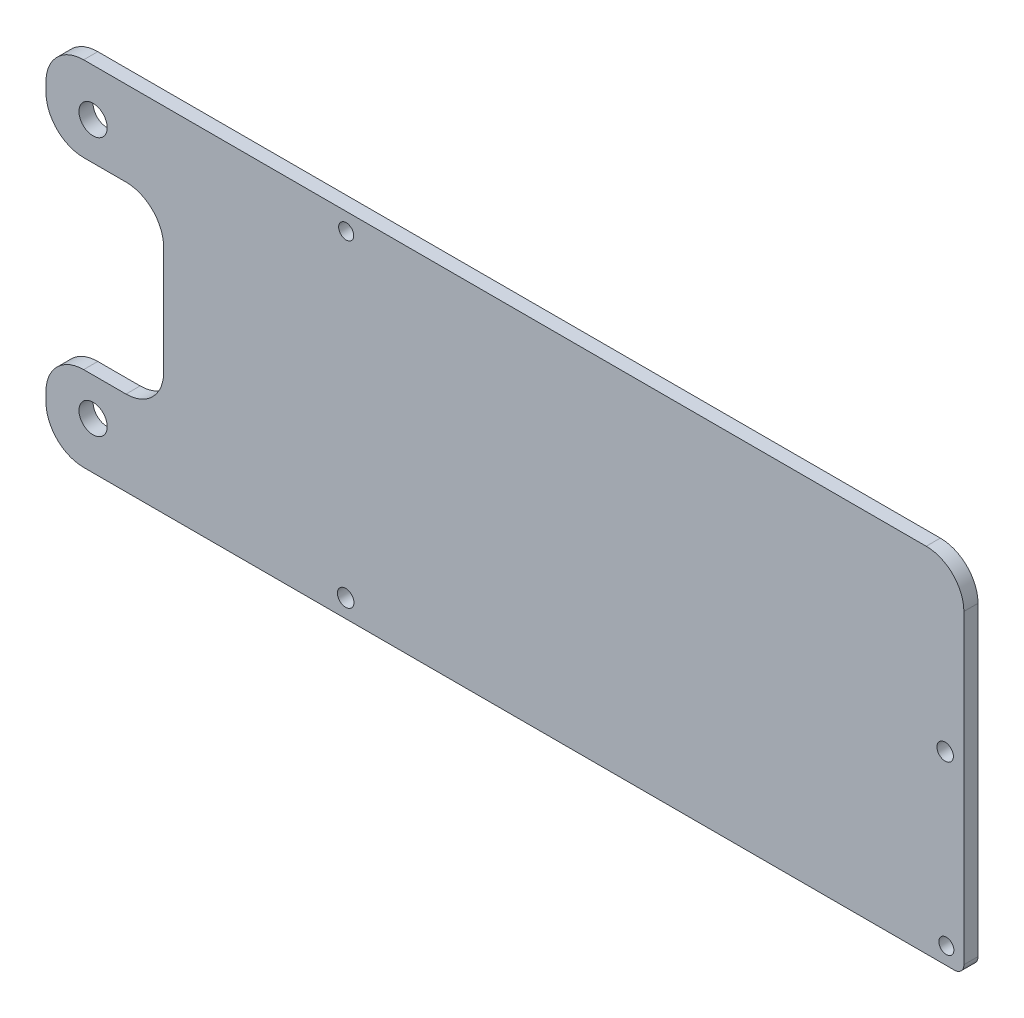
ISO-10303-21;
HEADER;
FILE_DESCRIPTION(('STEP AP214'),'2;1');
FILE_NAME('part.step','',(''),(''),'','','');
FILE_SCHEMA(('AUTOMOTIVE_DESIGN { 1 0 10303 214 1 1 1 1 }'));
ENDSEC;
DATA;
#1=APPLICATION_CONTEXT('core data for automotive mechanical design processes');
#2=APPLICATION_PROTOCOL_DEFINITION('international standard','automotive_design',2000,#1);
#3=PRODUCT_CONTEXT('',#1,'mechanical');
#4=PRODUCT('Part','Part','',(#3));
#5=PRODUCT_RELATED_PRODUCT_CATEGORY('part','',(#4));
#6=PRODUCT_DEFINITION_FORMATION('','',#4);
#7=PRODUCT_DEFINITION_CONTEXT('part definition',#1,'design');
#8=PRODUCT_DEFINITION('design','',#6,#7);
#9=PRODUCT_DEFINITION_SHAPE('','',#8);
#10=(LENGTH_UNIT() NAMED_UNIT(*) SI_UNIT(.MILLI.,.METRE.));
#11=(NAMED_UNIT(*) PLANE_ANGLE_UNIT() SI_UNIT($,.RADIAN.));
#12=(NAMED_UNIT(*) SI_UNIT($,.STERADIAN.) SOLID_ANGLE_UNIT());
#13=UNCERTAINTY_MEASURE_WITH_UNIT(LENGTH_MEASURE(1.E-05),#10,'distance_accuracy_value','');
#14=(GEOMETRIC_REPRESENTATION_CONTEXT(3) GLOBAL_UNCERTAINTY_ASSIGNED_CONTEXT((#13)) GLOBAL_UNIT_ASSIGNED_CONTEXT((#10,
#11,#12)) REPRESENTATION_CONTEXT('',''));
#15=CARTESIAN_POINT('',(0.,0.,0.));
#16=DIRECTION('',(0.,0.,1.));
#17=DIRECTION('',(1.,0.,0.));
#18=AXIS2_PLACEMENT_3D('',#15,#16,#17);
#19=CARTESIAN_POINT('',(0.,85.0000078,3.));
#20=DIRECTION('',(0.,-1.,0.));
#21=DIRECTION('',(1.,0.,0.));
#22=AXIS2_PLACEMENT_3D('',#19,#20,#21);
#23=PLANE('',#22);
#24=DIRECTION('',(-1.,0.,0.));
#25=VECTOR('',#24,1.);
#26=CARTESIAN_POINT('',(0.,85.0000078,3.));
#27=LINE('',#26,#25);
#28=CARTESIAN_POINT('',(136.9999894,85.0000078,3.));
#29=VERTEX_POINT('',#28);
#30=CARTESIAN_POINT('',(-41.9999946,85.0000078,3.));
#31=VERTEX_POINT('',#30);
#32=EDGE_CURVE('E171',#29,#31,#27,.T.);
#33=ORIENTED_EDGE('',*,*,#32,.F.);
#34=DIRECTION('',(0.,0.,-1.));
#35=VECTOR('',#34,1.);
#36=CARTESIAN_POINT('',(136.9999894,85.0000078,0.));
#37=LINE('',#36,#35);
#38=CARTESIAN_POINT('',(136.9999894,85.0000078,0.));
#39=VERTEX_POINT('',#38);
#40=EDGE_CURVE('E159',#29,#39,#37,.T.);
#41=ORIENTED_EDGE('',*,*,#40,.T.);
#42=DIRECTION('',(-1.,0.,0.));
#43=VECTOR('',#42,1.);
#44=CARTESIAN_POINT('',(0.,85.0000078,0.));
#45=LINE('',#44,#43);
#46=CARTESIAN_POINT('',(-41.9999946,85.0000078,0.));
#47=VERTEX_POINT('',#46);
#48=EDGE_CURVE('E168',#39,#47,#45,.T.);
#49=ORIENTED_EDGE('',*,*,#48,.T.);
#50=DIRECTION('',(0.,0.,-1.));
#51=VECTOR('',#50,1.);
#52=CARTESIAN_POINT('',(-41.9999946,85.0000078,3.));
#53=LINE('',#52,#51);
#54=EDGE_CURVE('E173',#47,#31,#53,.F.);
#55=ORIENTED_EDGE('',*,*,#54,.T.);
#56=EDGE_LOOP('',(#33,#41,#49,#55));
#57=FACE_BOUND('',#56,.T.);
#58=ADVANCED_FACE('F42',(#57),#23,.F.);
#59=CARTESIAN_POINT('',(-49.9999946,0.,3.));
#60=DIRECTION('',(1.,0.,0.));
#61=DIRECTION('',(0.,1.,0.));
#62=AXIS2_PLACEMENT_3D('',#59,#60,#61);
#63=PLANE('',#62);
#64=DIRECTION('',(0.,-1.,0.));
#65=VECTOR('',#64,1.);
#66=CARTESIAN_POINT('',(-49.9999946,0.,0.));
#67=LINE('',#66,#65);
#68=CARTESIAN_POINT('',(-49.9999946,77.0000078,0.));
#69=VERTEX_POINT('',#68);
#70=CARTESIAN_POINT('',(-49.9999946,75.0000078,0.));
#71=VERTEX_POINT('',#70);
#72=EDGE_CURVE('E179',#69,#71,#67,.T.);
#73=ORIENTED_EDGE('',*,*,#72,.T.);
#74=DIRECTION('',(0.,0.,-1.));
#75=VECTOR('',#74,1.);
#76=CARTESIAN_POINT('',(-49.9999946,75.0000078,3.));
#77=LINE('',#76,#75);
#78=CARTESIAN_POINT('',(-49.9999946,75.0000078,3.));
#79=VERTEX_POINT('',#78);
#80=EDGE_CURVE('E282',#71,#79,#77,.F.);
#81=ORIENTED_EDGE('',*,*,#80,.T.);
#82=DIRECTION('',(0.,-1.,0.));
#83=VECTOR('',#82,1.);
#84=CARTESIAN_POINT('',(-49.9999946,0.,3.));
#85=LINE('',#84,#83);
#86=CARTESIAN_POINT('',(-49.9999946,77.0000078,3.));
#87=VERTEX_POINT('',#86);
#88=EDGE_CURVE('E379',#87,#79,#85,.T.);
#89=ORIENTED_EDGE('',*,*,#88,.F.);
#90=DIRECTION('',(0.,0.,-1.));
#91=VECTOR('',#90,1.);
#92=CARTESIAN_POINT('',(-49.9999946,77.0000078,3.));
#93=LINE('',#92,#91);
#94=EDGE_CURVE('E279',#87,#69,#93,.T.);
#95=ORIENTED_EDGE('',*,*,#94,.T.);
#96=EDGE_LOOP('',(#73,#81,#89,#95));
#97=FACE_BOUND('',#96,.T.);
#98=ADVANCED_FACE('F375',(#97),#63,.F.);
#99=CARTESIAN_POINT('',(0.,67.0000078,3.));
#100=DIRECTION('',(0.,1.,0.));
#101=DIRECTION('',(-1.,0.,0.));
#102=AXIS2_PLACEMENT_3D('',#99,#100,#101);
#103=PLANE('',#102);
#104=DIRECTION('',(1.,0.,0.));
#105=VECTOR('',#104,1.);
#106=CARTESIAN_POINT('',(0.,67.0000078,3.));
#107=LINE('',#106,#105);
#108=CARTESIAN_POINT('',(-41.9999946,67.0000078,3.));
#109=VERTEX_POINT('',#108);
#110=CARTESIAN_POINT('',(-32.9999946,67.0000078,3.));
#111=VERTEX_POINT('',#110);
#112=EDGE_CURVE('E369',#109,#111,#107,.T.);
#113=ORIENTED_EDGE('',*,*,#112,.F.);
#114=DIRECTION('',(0.,0.,-1.));
#115=VECTOR('',#114,1.);
#116=CARTESIAN_POINT('',(-41.9999946,67.0000078,3.));
#117=LINE('',#116,#115);
#118=CARTESIAN_POINT('',(-41.9999946,67.0000078,0.));
#119=VERTEX_POINT('',#118);
#120=EDGE_CURVE('E276',#109,#119,#117,.T.);
#121=ORIENTED_EDGE('',*,*,#120,.T.);
#122=DIRECTION('',(1.,0.,0.));
#123=VECTOR('',#122,1.);
#124=CARTESIAN_POINT('',(0.,67.0000078,0.));
#125=LINE('',#124,#123);
#126=CARTESIAN_POINT('',(-32.9999946,67.0000078,0.));
#127=VERTEX_POINT('',#126);
#128=EDGE_CURVE('E183',#119,#127,#125,.T.);
#129=ORIENTED_EDGE('',*,*,#128,.T.);
#130=DIRECTION('',(0.,0.,-1.));
#131=VECTOR('',#130,1.);
#132=CARTESIAN_POINT('',(-32.9999946,67.0000078,3.));
#133=LINE('',#132,#131);
#134=EDGE_CURVE('E272',#127,#111,#133,.F.);
#135=ORIENTED_EDGE('',*,*,#134,.T.);
#136=EDGE_LOOP('',(#113,#121,#129,#135));
#137=FACE_BOUND('',#136,.T.);
#138=ADVANCED_FACE('F366',(#137),#103,.F.);
#139=CARTESIAN_POINT('',(-24.9999946,0.,3.));
#140=DIRECTION('',(1.,0.,0.));
#141=DIRECTION('',(0.,0.,-1.));
#142=AXIS2_PLACEMENT_3D('',#139,#140,#141);
#143=PLANE('',#142);
#144=DIRECTION('',(0.,-1.,0.));
#145=VECTOR('',#144,1.);
#146=CARTESIAN_POINT('',(-24.9999946,0.,0.));
#147=LINE('',#146,#145);
#148=CARTESIAN_POINT('',(-24.9999946,59.0000078,0.));
#149=VERTEX_POINT('',#148);
#150=CARTESIAN_POINT('',(-24.9999946,36.0000054,0.));
#151=VERTEX_POINT('',#150);
#152=EDGE_CURVE('E192',#149,#151,#147,.T.);
#153=ORIENTED_EDGE('',*,*,#152,.T.);
#154=DIRECTION('',(0.,0.,-1.));
#155=VECTOR('',#154,1.);
#156=CARTESIAN_POINT('',(-24.9999946,36.0000054,3.));
#157=LINE('',#156,#155);
#158=CARTESIAN_POINT('',(-24.9999946,36.0000054,3.));
#159=VERTEX_POINT('',#158);
#160=EDGE_CURVE('E300',#151,#159,#157,.F.);
#161=ORIENTED_EDGE('',*,*,#160,.T.);
#162=DIRECTION('',(0.,-1.,0.));
#163=VECTOR('',#162,1.);
#164=CARTESIAN_POINT('',(-24.9999946,0.,3.));
#165=LINE('',#164,#163);
#166=CARTESIAN_POINT('',(-24.9999946,59.0000078,3.));
#167=VERTEX_POINT('',#166);
#168=EDGE_CURVE('E358',#167,#159,#165,.T.);
#169=ORIENTED_EDGE('',*,*,#168,.F.);
#170=DIRECTION('',(0.,0.,-1.));
#171=VECTOR('',#170,1.);
#172=CARTESIAN_POINT('',(-24.9999946,59.0000078,0.));
#173=LINE('',#172,#171);
#174=EDGE_CURVE('E297',#167,#149,#173,.T.);
#175=ORIENTED_EDGE('',*,*,#174,.T.);
#176=EDGE_LOOP('',(#153,#161,#169,#175));
#177=FACE_BOUND('',#176,.T.);
#178=ADVANCED_FACE('F354',(#177),#143,.F.);
#179=CARTESIAN_POINT('',(0.,28.0000054,3.));
#180=DIRECTION('',(0.,1.,0.));
#181=DIRECTION('',(0.,0.,1.));
#182=AXIS2_PLACEMENT_3D('',#179,#180,#181);
#183=PLANE('',#182);
#184=DIRECTION('',(1.,0.,0.));
#185=VECTOR('',#184,1.);
#186=CARTESIAN_POINT('',(0.,28.0000054,0.));
#187=LINE('',#186,#185);
#188=CARTESIAN_POINT('',(-41.9999946,28.0000054,0.));
#189=VERTEX_POINT('',#188);
#190=CARTESIAN_POINT('',(-32.9999946,28.0000054,0.));
#191=VERTEX_POINT('',#190);
#192=EDGE_CURVE('E195',#189,#191,#187,.T.);
#193=ORIENTED_EDGE('',*,*,#192,.F.);
#194=DIRECTION('',(0.,0.,-1.));
#195=VECTOR('',#194,1.);
#196=CARTESIAN_POINT('',(-41.9999946,28.0000054,3.));
#197=LINE('',#196,#195);
#198=CARTESIAN_POINT('',(-41.9999946,28.0000054,3.));
#199=VERTEX_POINT('',#198);
#200=EDGE_CURVE('E295',#189,#199,#197,.F.);
#201=ORIENTED_EDGE('',*,*,#200,.T.);
#202=DIRECTION('',(1.,0.,0.));
#203=VECTOR('',#202,1.);
#204=CARTESIAN_POINT('',(0.,28.0000054,3.));
#205=LINE('',#204,#203);
#206=CARTESIAN_POINT('',(-32.9999946,28.0000054,3.));
#207=VERTEX_POINT('',#206);
#208=EDGE_CURVE('E247',#199,#207,#205,.T.);
#209=ORIENTED_EDGE('',*,*,#208,.T.);
#210=DIRECTION('',(0.,0.,-1.));
#211=VECTOR('',#210,1.);
#212=CARTESIAN_POINT('',(-32.9999946,28.0000054,3.));
#213=LINE('',#212,#211);
#214=EDGE_CURVE('E292',#207,#191,#213,.T.);
#215=ORIENTED_EDGE('',*,*,#214,.T.);
#216=EDGE_LOOP('',(#193,#201,#209,#215));
#217=FACE_BOUND('',#216,.T.);
#218=ADVANCED_FACE('F344',(#217),#183,.T.);
#219=CARTESIAN_POINT('',(-49.9999946,0.,3.));
#220=DIRECTION('',(1.,0.,0.));
#221=DIRECTION('',(0.,1.,0.));
#222=AXIS2_PLACEMENT_3D('',#219,#220,#221);
#223=PLANE('',#222);
#224=DIRECTION('',(0.,-1.,0.));
#225=VECTOR('',#224,1.);
#226=CARTESIAN_POINT('',(-49.9999946,0.,0.));
#227=LINE('',#226,#225);
#228=CARTESIAN_POINT('',(-49.9999946,20.0000054,0.));
#229=VERTEX_POINT('',#228);
#230=CARTESIAN_POINT('',(-49.9999946,18.0000054,0.));
#231=VERTEX_POINT('',#230);
#232=EDGE_CURVE('E198',#229,#231,#227,.T.);
#233=ORIENTED_EDGE('',*,*,#232,.T.);
#234=DIRECTION('',(0.,0.,-1.));
#235=VECTOR('',#234,1.);
#236=CARTESIAN_POINT('',(-49.9999946,18.0000054,3.));
#237=LINE('',#236,#235);
#238=CARTESIAN_POINT('',(-49.9999946,18.0000054,3.));
#239=VERTEX_POINT('',#238);
#240=EDGE_CURVE('E290',#231,#239,#237,.F.);
#241=ORIENTED_EDGE('',*,*,#240,.T.);
#242=DIRECTION('',(0.,-1.,0.));
#243=VECTOR('',#242,1.);
#244=CARTESIAN_POINT('',(-49.9999946,0.,3.));
#245=LINE('',#244,#243);
#246=CARTESIAN_POINT('',(-49.9999946,20.0000054,3.));
#247=VERTEX_POINT('',#246);
#248=EDGE_CURVE('E241',#247,#239,#245,.T.);
#249=ORIENTED_EDGE('',*,*,#248,.F.);
#250=DIRECTION('',(0.,0.,-1.));
#251=VECTOR('',#250,1.);
#252=CARTESIAN_POINT('',(-49.9999946,20.0000054,0.));
#253=LINE('',#252,#251);
#254=EDGE_CURVE('E287',#247,#229,#253,.T.);
#255=ORIENTED_EDGE('',*,*,#254,.T.);
#256=EDGE_LOOP('',(#233,#241,#249,#255));
#257=FACE_BOUND('',#256,.T.);
#258=ADVANCED_FACE('F335',(#257),#223,.F.);
#259=CARTESIAN_POINT('',(0.,10.0000054,3.));
#260=DIRECTION('',(0.,-1.,0.));
#261=DIRECTION('',(1.,0.,0.));
#262=AXIS2_PLACEMENT_3D('',#259,#260,#261);
#263=PLANE('',#262);
#264=DIRECTION('',(-1.,0.,0.));
#265=VECTOR('',#264,1.);
#266=CARTESIAN_POINT('',(0.,10.0000054,0.));
#267=LINE('',#266,#265);
#268=CARTESIAN_POINT('',(142.9999894,10.0000054,0.));
#269=VERTEX_POINT('',#268);
#270=CARTESIAN_POINT('',(-41.9999946,10.0000054,0.));
#271=VERTEX_POINT('',#270);
#272=EDGE_CURVE('E201',#269,#271,#267,.T.);
#273=ORIENTED_EDGE('',*,*,#272,.F.);
#274=DIRECTION('',(0.,0.,-1.));
#275=VECTOR('',#274,1.);
#276=CARTESIAN_POINT('',(142.9999894,10.0000054,3.));
#277=LINE('',#276,#275);
#278=CARTESIAN_POINT('',(142.9999894,10.0000054,3.));
#279=VERTEX_POINT('',#278);
#280=EDGE_CURVE('E52',#269,#279,#277,.F.);
#281=ORIENTED_EDGE('',*,*,#280,.T.);
#282=DIRECTION('',(-1.,0.,0.));
#283=VECTOR('',#282,1.);
#284=CARTESIAN_POINT('',(0.,10.0000054,3.));
#285=LINE('',#284,#283);
#286=CARTESIAN_POINT('',(-41.9999946,10.0000054,3.));
#287=VERTEX_POINT('',#286);
#288=EDGE_CURVE('E246',#279,#287,#285,.T.);
#289=ORIENTED_EDGE('',*,*,#288,.T.);
#290=DIRECTION('',(0.,0.,-1.));
#291=VECTOR('',#290,1.);
#292=CARTESIAN_POINT('',(-41.9999946,10.0000054,0.));
#293=LINE('',#292,#291);
#294=EDGE_CURVE('E284',#287,#271,#293,.T.);
#295=ORIENTED_EDGE('',*,*,#294,.T.);
#296=EDGE_LOOP('',(#273,#281,#289,#295));
#297=FACE_BOUND('',#296,.T.);
#298=ADVANCED_FACE('F328',(#297),#263,.T.);
#299=CARTESIAN_POINT('',(13.7725658,81.3248056,3.));
#300=DIRECTION('',(0.,0.,-1.));
#301=DIRECTION('',(-1.,0.,0.));
#302=AXIS2_PLACEMENT_3D('',#299,#300,#301);
#303=CYLINDRICAL_SURFACE('',#302,1.5999968);
#304=CARTESIAN_POINT('',(13.7725658,81.3248056,3.));
#305=DIRECTION('',(0.,0.,1.));
#306=DIRECTION('',(1.,0.,0.));
#307=AXIS2_PLACEMENT_3D('',#304,#305,#306);
#308=CIRCLE('',#307,1.5999968);
#309=CARTESIAN_POINT('',(15.3725626,81.3248056,3.));
#310=VERTEX_POINT('',#309);
#311=EDGE_CURVE('E414',#310,#310,#308,.T.);
#312=ORIENTED_EDGE('',*,*,#311,.T.);
#313=EDGE_LOOP('',(#312));
#314=FACE_BOUND('',#313,.T.);
#315=CARTESIAN_POINT('',(13.7725658,81.3248056,0.));
#316=DIRECTION('',(0.,0.,1.));
#317=DIRECTION('',(1.,0.,0.));
#318=AXIS2_PLACEMENT_3D('',#315,#316,#317);
#319=CIRCLE('',#318,1.5999968);
#320=CARTESIAN_POINT('',(15.3725626,81.3248056,0.));
#321=VERTEX_POINT('',#320);
#322=EDGE_CURVE('E211',#321,#321,#319,.T.);
#323=ORIENTED_EDGE('',*,*,#322,.F.);
#324=EDGE_LOOP('',(#323));
#325=FACE_BOUND('',#324,.T.);
#326=ADVANCED_FACE('F461',(#314,#325),#303,.F.);
#327=CARTESIAN_POINT('',(141.0208,49.2252,3.));
#328=DIRECTION('',(0.,0.,-1.));
#329=DIRECTION('',(-1.,0.,0.));
#330=AXIS2_PLACEMENT_3D('',#327,#328,#329);
#331=CYLINDRICAL_SURFACE('',#330,1.74999649999999);
#332=CARTESIAN_POINT('',(141.0208,49.2252,3.));
#333=DIRECTION('',(0.,0.,1.));
#334=DIRECTION('',(1.,0.,0.));
#335=AXIS2_PLACEMENT_3D('',#332,#333,#334);
#336=CIRCLE('',#335,1.74999649999999);
#337=CARTESIAN_POINT('',(142.7707965,49.2252,3.));
#338=VERTEX_POINT('',#337);
#339=EDGE_CURVE('E411',#338,#338,#336,.T.);
#340=ORIENTED_EDGE('',*,*,#339,.T.);
#341=EDGE_LOOP('',(#340));
#342=FACE_BOUND('',#341,.T.);
#343=CARTESIAN_POINT('',(141.0208,49.2252,0.));
#344=DIRECTION('',(0.,0.,1.));
#345=DIRECTION('',(1.,0.,0.));
#346=AXIS2_PLACEMENT_3D('',#343,#344,#345);
#347=CIRCLE('',#346,1.74999649999999);
#348=CARTESIAN_POINT('',(142.7707965,49.2252,0.));
#349=VERTEX_POINT('',#348);
#350=EDGE_CURVE('E208',#349,#349,#347,.T.);
#351=ORIENTED_EDGE('',*,*,#350,.F.);
#352=EDGE_LOOP('',(#351));
#353=FACE_BOUND('',#352,.T.);
#354=ADVANCED_FACE('F467',(#342,#353),#331,.F.);
#355=CARTESIAN_POINT('',(141.2748,13.6144,3.));
#356=DIRECTION('',(0.,0.,-1.));
#357=DIRECTION('',(-1.,0.,0.));
#358=AXIS2_PLACEMENT_3D('',#355,#356,#357);
#359=CYLINDRICAL_SURFACE('',#358,1.5999968);
#360=CARTESIAN_POINT('',(141.2748,13.6144,3.));
#361=DIRECTION('',(0.,0.,1.));
#362=DIRECTION('',(1.,0.,0.));
#363=AXIS2_PLACEMENT_3D('',#360,#361,#362);
#364=CIRCLE('',#363,1.5999968);
#365=CARTESIAN_POINT('',(142.8747968,13.6144,3.));
#366=VERTEX_POINT('',#365);
#367=EDGE_CURVE('E408',#366,#366,#364,.T.);
#368=ORIENTED_EDGE('',*,*,#367,.T.);
#369=EDGE_LOOP('',(#368));
#370=FACE_BOUND('',#369,.T.);
#371=CARTESIAN_POINT('',(141.2748,13.6144,0.));
#372=DIRECTION('',(0.,0.,1.));
#373=DIRECTION('',(1.,0.,0.));
#374=AXIS2_PLACEMENT_3D('',#371,#372,#373);
#375=CIRCLE('',#374,1.5999968);
#376=CARTESIAN_POINT('',(142.8747968,13.6144,0.));
#377=VERTEX_POINT('',#376);
#378=EDGE_CURVE('E205',#377,#377,#375,.T.);
#379=ORIENTED_EDGE('',*,*,#378,.F.);
#380=EDGE_LOOP('',(#379));
#381=FACE_BOUND('',#380,.T.);
#382=ADVANCED_FACE('F464',(#370,#381),#359,.F.);
#383=CARTESIAN_POINT('',(144.9999894,0.,3.));
#384=DIRECTION('',(1.,0.,0.));
#385=DIRECTION('',(0.,0.,-1.));
#386=AXIS2_PLACEMENT_3D('',#383,#384,#385);
#387=PLANE('',#386);
#388=DIRECTION('',(0.,-1.,0.));
#389=VECTOR('',#388,1.);
#390=CARTESIAN_POINT('',(144.9999894,0.,3.));
#391=LINE('',#390,#389);
#392=CARTESIAN_POINT('',(144.9999894,77.0000078,3.));
#393=VERTEX_POINT('',#392);
#394=CARTESIAN_POINT('',(144.9999894,12.0000054,3.));
#395=VERTEX_POINT('',#394);
#396=EDGE_CURVE('E253',#393,#395,#391,.T.);
#397=ORIENTED_EDGE('',*,*,#396,.T.);
#398=DIRECTION('',(0.,0.,-1.));
#399=VECTOR('',#398,1.);
#400=CARTESIAN_POINT('',(144.9999894,12.0000054,3.));
#401=LINE('',#400,#399);
#402=CARTESIAN_POINT('',(144.9999894,12.0000054,0.));
#403=VERTEX_POINT('',#402);
#404=EDGE_CURVE('E312',#395,#403,#401,.T.);
#405=ORIENTED_EDGE('',*,*,#404,.T.);
#406=DIRECTION('',(0.,-1.,0.));
#407=VECTOR('',#406,1.);
#408=CARTESIAN_POINT('',(144.9999894,0.,0.));
#409=LINE('',#408,#407);
#410=CARTESIAN_POINT('',(144.9999894,77.0000078,0.));
#411=VERTEX_POINT('',#410);
#412=EDGE_CURVE('E203',#411,#403,#409,.T.);
#413=ORIENTED_EDGE('',*,*,#412,.F.);
#414=DIRECTION('',(0.,0.,-1.));
#415=VECTOR('',#414,1.);
#416=CARTESIAN_POINT('',(144.9999894,77.0000078,3.));
#417=LINE('',#416,#415);
#418=EDGE_CURVE('E160',#411,#393,#417,.F.);
#419=ORIENTED_EDGE('',*,*,#418,.T.);
#420=EDGE_LOOP('',(#397,#405,#413,#419));
#421=FACE_BOUND('',#420,.T.);
#422=ADVANCED_FACE('F318',(#421),#387,.T.);
#423=CARTESIAN_POINT('',(-39.9999946,20.0000054,3.));
#424=DIRECTION('',(0.,0.,-1.));
#425=DIRECTION('',(-1.,0.,0.));
#426=AXIS2_PLACEMENT_3D('',#423,#424,#425);
#427=CYLINDRICAL_SURFACE('',#426,3.);
#428=CARTESIAN_POINT('',(-39.9999946,20.0000054,3.));
#429=DIRECTION('',(0.,0.,1.));
#430=DIRECTION('',(1.,0.,0.));
#431=AXIS2_PLACEMENT_3D('',#428,#429,#430);
#432=CIRCLE('',#431,3.);
#433=CARTESIAN_POINT('',(-36.9999946,20.0000054,3.));
#434=VERTEX_POINT('',#433);
#435=EDGE_CURVE('E385',#434,#434,#432,.T.);
#436=ORIENTED_EDGE('',*,*,#435,.T.);
#437=EDGE_LOOP('',(#436));
#438=FACE_BOUND('',#437,.T.);
#439=CARTESIAN_POINT('',(-39.9999946,20.0000054,0.));
#440=DIRECTION('',(0.,0.,1.));
#441=DIRECTION('',(1.,0.,0.));
#442=AXIS2_PLACEMENT_3D('',#439,#440,#441);
#443=CIRCLE('',#442,3.);
#444=CARTESIAN_POINT('',(-36.9999946,20.0000054,0.));
#445=VERTEX_POINT('',#444);
#446=EDGE_CURVE('E180',#445,#445,#443,.T.);
#447=ORIENTED_EDGE('',*,*,#446,.F.);
#448=EDGE_LOOP('',(#447));
#449=FACE_BOUND('',#448,.T.);
#450=ADVANCED_FACE('F432',(#438,#449),#427,.F.);
#451=CARTESIAN_POINT('',(-39.9999946,75.0000078,3.));
#452=DIRECTION('',(0.,0.,-1.));
#453=DIRECTION('',(-1.,0.,0.));
#454=AXIS2_PLACEMENT_3D('',#451,#452,#453);
#455=CYLINDRICAL_SURFACE('',#454,3.);
#456=CARTESIAN_POINT('',(-39.9999946,75.0000078,3.));
#457=DIRECTION('',(0.,0.,1.));
#458=DIRECTION('',(1.,0.,0.));
#459=AXIS2_PLACEMENT_3D('',#456,#457,#458);
#460=CIRCLE('',#459,3.);
#461=CARTESIAN_POINT('',(-36.9999946,75.0000078,3.));
#462=VERTEX_POINT('',#461);
#463=EDGE_CURVE('E217',#462,#462,#460,.T.);
#464=ORIENTED_EDGE('',*,*,#463,.T.);
#465=EDGE_LOOP('',(#464));
#466=FACE_BOUND('',#465,.T.);
#467=CARTESIAN_POINT('',(-39.9999946,75.0000078,0.));
#468=DIRECTION('',(0.,0.,1.));
#469=DIRECTION('',(1.,0.,0.));
#470=AXIS2_PLACEMENT_3D('',#467,#468,#469);
#471=CIRCLE('',#470,3.);
#472=CARTESIAN_POINT('',(-36.9999946,75.0000078,0.));
#473=VERTEX_POINT('',#472);
#474=EDGE_CURVE('E186',#473,#473,#471,.T.);
#475=ORIENTED_EDGE('',*,*,#474,.F.);
#476=EDGE_LOOP('',(#475));
#477=FACE_BOUND('',#476,.T.);
#478=ADVANCED_FACE('F429',(#466,#477),#455,.F.);
#479=CARTESIAN_POINT('',(13.6652,13.843,3.));
#480=DIRECTION('',(0.,0.,-1.));
#481=DIRECTION('',(-1.,0.,0.));
#482=AXIS2_PLACEMENT_3D('',#479,#480,#481);
#483=CYLINDRICAL_SURFACE('',#482,1.7499965);
#484=CARTESIAN_POINT('',(13.6652,13.843,3.));
#485=DIRECTION('',(0.,0.,1.));
#486=DIRECTION('',(1.,0.,0.));
#487=AXIS2_PLACEMENT_3D('',#484,#485,#486);
#488=CIRCLE('',#487,1.7499965);
#489=CARTESIAN_POINT('',(15.4151965,13.843,3.));
#490=VERTEX_POINT('',#489);
#491=EDGE_CURVE('E218',#490,#490,#488,.T.);
#492=ORIENTED_EDGE('',*,*,#491,.T.);
#493=EDGE_LOOP('',(#492));
#494=FACE_BOUND('',#493,.T.);
#495=CARTESIAN_POINT('',(13.6652,13.843,0.));
#496=DIRECTION('',(0.,0.,1.));
#497=DIRECTION('',(1.,0.,0.));
#498=AXIS2_PLACEMENT_3D('',#495,#496,#497);
#499=CIRCLE('',#498,1.7499965);
#500=CARTESIAN_POINT('',(15.4151965,13.843,0.));
#501=VERTEX_POINT('',#500);
#502=EDGE_CURVE('E214',#501,#501,#499,.T.);
#503=ORIENTED_EDGE('',*,*,#502,.F.);
#504=EDGE_LOOP('',(#503));
#505=FACE_BOUND('',#504,.T.);
#506=ADVANCED_FACE('F431',(#494,#505),#483,.F.);
#507=CARTESIAN_POINT('',(0.,0.,3.));
#508=DIRECTION('',(0.,0.,1.));
#509=DIRECTION('',(1.,0.,0.));
#510=AXIS2_PLACEMENT_3D('',#507,#508,#509);
#511=PLANE('',#510);
#512=ORIENTED_EDGE('',*,*,#463,.F.);
#513=EDGE_LOOP('',(#512));
#514=FACE_BOUND('',#513,.T.);
#515=ORIENTED_EDGE('',*,*,#435,.F.);
#516=EDGE_LOOP('',(#515));
#517=FACE_BOUND('',#516,.T.);
#518=ORIENTED_EDGE('',*,*,#288,.F.);
#519=CARTESIAN_POINT('',(142.9999894,12.0000054,3.));
#520=DIRECTION('',(0.,0.,1.));
#521=DIRECTION('',(1.,0.,0.));
#522=AXIS2_PLACEMENT_3D('',#519,#520,#521);
#523=CIRCLE('',#522,2.);
#524=EDGE_CURVE('E12',#279,#395,#523,.T.);
#525=ORIENTED_EDGE('',*,*,#524,.T.);
#526=ORIENTED_EDGE('',*,*,#396,.F.);
#527=CARTESIAN_POINT('',(136.9999894,77.0000078,3.));
#528=DIRECTION('',(0.,0.,1.));
#529=DIRECTION('',(1.,0.,0.));
#530=AXIS2_PLACEMENT_3D('',#527,#528,#529);
#531=CIRCLE('',#530,8.);
#532=EDGE_CURVE('E267',#393,#29,#531,.T.);
#533=ORIENTED_EDGE('',*,*,#532,.T.);
#534=ORIENTED_EDGE('',*,*,#32,.T.);
#535=CARTESIAN_POINT('',(-41.9999946,77.0000078,3.));
#536=DIRECTION('',(0.,0.,1.));
#537=DIRECTION('',(1.,0.,0.));
#538=AXIS2_PLACEMENT_3D('',#535,#536,#537);
#539=CIRCLE('',#538,8.);
#540=EDGE_CURVE('E383',#31,#87,#539,.T.);
#541=ORIENTED_EDGE('',*,*,#540,.T.);
#542=ORIENTED_EDGE('',*,*,#88,.T.);
#543=CARTESIAN_POINT('',(-41.9999946,75.0000078,3.));
#544=DIRECTION('',(0.,0.,1.));
#545=DIRECTION('',(1.,0.,0.));
#546=AXIS2_PLACEMENT_3D('',#543,#544,#545);
#547=CIRCLE('',#546,8.);
#548=EDGE_CURVE('E273',#79,#109,#547,.T.);
#549=ORIENTED_EDGE('',*,*,#548,.T.);
#550=ORIENTED_EDGE('',*,*,#112,.T.);
#551=CARTESIAN_POINT('',(-32.9999946,59.0000078,3.));
#552=DIRECTION('',(0.,0.,1.));
#553=DIRECTION('',(1.,0.,0.));
#554=AXIS2_PLACEMENT_3D('',#551,#552,#553);
#555=CIRCLE('',#554,8.);
#556=EDGE_CURVE('E309',#111,#167,#555,.F.);
#557=ORIENTED_EDGE('',*,*,#556,.T.);
#558=ORIENTED_EDGE('',*,*,#168,.T.);
#559=CARTESIAN_POINT('',(-32.9999946,36.0000054,3.));
#560=DIRECTION('',(0.,0.,1.));
#561=DIRECTION('',(1.,0.,0.));
#562=AXIS2_PLACEMENT_3D('',#559,#560,#561);
#563=CIRCLE('',#562,8.);
#564=EDGE_CURVE('E304',#159,#207,#563,.F.);
#565=ORIENTED_EDGE('',*,*,#564,.T.);
#566=ORIENTED_EDGE('',*,*,#208,.F.);
#567=CARTESIAN_POINT('',(-41.9999946,20.0000054,3.));
#568=DIRECTION('',(0.,0.,1.));
#569=DIRECTION('',(1.,0.,0.));
#570=AXIS2_PLACEMENT_3D('',#567,#568,#569);
#571=CIRCLE('',#570,8.);
#572=EDGE_CURVE('E226',#199,#247,#571,.T.);
#573=ORIENTED_EDGE('',*,*,#572,.T.);
#574=ORIENTED_EDGE('',*,*,#248,.T.);
#575=CARTESIAN_POINT('',(-41.9999946,18.0000054,3.));
#576=DIRECTION('',(0.,0.,1.));
#577=DIRECTION('',(1.,0.,0.));
#578=AXIS2_PLACEMENT_3D('',#575,#576,#577);
#579=CIRCLE('',#578,8.);
#580=EDGE_CURVE('E230',#239,#287,#579,.T.);
#581=ORIENTED_EDGE('',*,*,#580,.T.);
#582=EDGE_LOOP('',(#518,#525,#526,#533,#534,#541,#542,#549,#550,#557,#558,#565,#566,#573,#574,#581));
#583=FACE_BOUND('',#582,.T.);
#584=ORIENTED_EDGE('',*,*,#367,.F.);
#585=EDGE_LOOP('',(#584));
#586=FACE_BOUND('',#585,.T.);
#587=ORIENTED_EDGE('',*,*,#339,.F.);
#588=EDGE_LOOP('',(#587));
#589=FACE_BOUND('',#588,.T.);
#590=ORIENTED_EDGE('',*,*,#311,.F.);
#591=EDGE_LOOP('',(#590));
#592=FACE_BOUND('',#591,.T.);
#593=ORIENTED_EDGE('',*,*,#491,.F.);
#594=EDGE_LOOP('',(#593));
#595=FACE_BOUND('',#594,.T.);
#596=ADVANCED_FACE('F323',(#514,#517,#583,#586,#589,#592,#595),#511,.T.);
#597=CARTESIAN_POINT('',(0.,0.,0.));
#598=DIRECTION('',(0.,0.,1.));
#599=DIRECTION('',(1.,0.,0.));
#600=AXIS2_PLACEMENT_3D('',#597,#598,#599);
#601=PLANE('',#600);
#602=ORIENTED_EDGE('',*,*,#474,.T.);
#603=EDGE_LOOP('',(#602));
#604=FACE_BOUND('',#603,.T.);
#605=ORIENTED_EDGE('',*,*,#446,.T.);
#606=EDGE_LOOP('',(#605));
#607=FACE_BOUND('',#606,.T.);
#608=ORIENTED_EDGE('',*,*,#412,.T.);
#609=CARTESIAN_POINT('',(142.9999894,12.0000054,0.));
#610=DIRECTION('',(0.,0.,1.));
#611=DIRECTION('',(1.,0.,0.));
#612=AXIS2_PLACEMENT_3D('',#609,#610,#611);
#613=CIRCLE('',#612,2.);
#614=EDGE_CURVE('E66',#403,#269,#613,.F.);
#615=ORIENTED_EDGE('',*,*,#614,.T.);
#616=ORIENTED_EDGE('',*,*,#272,.T.);
#617=CARTESIAN_POINT('',(-41.9999946,18.0000054,0.));
#618=DIRECTION('',(0.,0.,1.));
#619=DIRECTION('',(1.,0.,0.));
#620=AXIS2_PLACEMENT_3D('',#617,#618,#619);
#621=CIRCLE('',#620,8.);
#622=EDGE_CURVE('E221',#271,#231,#621,.F.);
#623=ORIENTED_EDGE('',*,*,#622,.T.);
#624=ORIENTED_EDGE('',*,*,#232,.F.);
#625=CARTESIAN_POINT('',(-41.9999946,20.0000054,0.));
#626=DIRECTION('',(0.,0.,1.));
#627=DIRECTION('',(1.,0.,0.));
#628=AXIS2_PLACEMENT_3D('',#625,#626,#627);
#629=CIRCLE('',#628,8.);
#630=EDGE_CURVE('E172',#229,#189,#629,.F.);
#631=ORIENTED_EDGE('',*,*,#630,.T.);
#632=ORIENTED_EDGE('',*,*,#192,.T.);
#633=CARTESIAN_POINT('',(-32.9999946,36.0000054,0.));
#634=DIRECTION('',(0.,0.,1.));
#635=DIRECTION('',(1.,0.,0.));
#636=AXIS2_PLACEMENT_3D('',#633,#634,#635);
#637=CIRCLE('',#636,8.);
#638=EDGE_CURVE('E302',#191,#151,#637,.T.);
#639=ORIENTED_EDGE('',*,*,#638,.T.);
#640=ORIENTED_EDGE('',*,*,#152,.F.);
#641=CARTESIAN_POINT('',(-32.9999946,59.0000078,0.));
#642=DIRECTION('',(0.,0.,1.));
#643=DIRECTION('',(1.,0.,0.));
#644=AXIS2_PLACEMENT_3D('',#641,#642,#643);
#645=CIRCLE('',#644,8.);
#646=EDGE_CURVE('E307',#149,#127,#645,.T.);
#647=ORIENTED_EDGE('',*,*,#646,.T.);
#648=ORIENTED_EDGE('',*,*,#128,.F.);
#649=CARTESIAN_POINT('',(-41.9999946,75.0000078,0.));
#650=DIRECTION('',(0.,0.,1.));
#651=DIRECTION('',(1.,0.,0.));
#652=AXIS2_PLACEMENT_3D('',#649,#650,#651);
#653=CIRCLE('',#652,8.);
#654=EDGE_CURVE('E163',#119,#71,#653,.F.);
#655=ORIENTED_EDGE('',*,*,#654,.T.);
#656=ORIENTED_EDGE('',*,*,#72,.F.);
#657=CARTESIAN_POINT('',(-41.9999946,77.0000078,0.));
#658=DIRECTION('',(0.,0.,1.));
#659=DIRECTION('',(1.,0.,0.));
#660=AXIS2_PLACEMENT_3D('',#657,#658,#659);
#661=CIRCLE('',#660,8.);
#662=EDGE_CURVE('E178',#69,#47,#661,.F.);
#663=ORIENTED_EDGE('',*,*,#662,.T.);
#664=ORIENTED_EDGE('',*,*,#48,.F.);
#665=CARTESIAN_POINT('',(136.9999894,77.0000078,0.));
#666=DIRECTION('',(0.,0.,1.));
#667=DIRECTION('',(1.,0.,0.));
#668=AXIS2_PLACEMENT_3D('',#665,#666,#667);
#669=CIRCLE('',#668,8.);
#670=EDGE_CURVE('E155',#39,#411,#669,.F.);
#671=ORIENTED_EDGE('',*,*,#670,.T.);
#672=EDGE_LOOP('',(#608,#615,#616,#623,#624,#631,#632,#639,#640,#647,#648,#655,#656,#663,#664,#671));
#673=FACE_BOUND('',#672,.T.);
#674=ORIENTED_EDGE('',*,*,#378,.T.);
#675=EDGE_LOOP('',(#674));
#676=FACE_BOUND('',#675,.T.);
#677=ORIENTED_EDGE('',*,*,#350,.T.);
#678=EDGE_LOOP('',(#677));
#679=FACE_BOUND('',#678,.T.);
#680=ORIENTED_EDGE('',*,*,#322,.T.);
#681=EDGE_LOOP('',(#680));
#682=FACE_BOUND('',#681,.T.);
#683=ORIENTED_EDGE('',*,*,#502,.T.);
#684=EDGE_LOOP('',(#683));
#685=FACE_BOUND('',#684,.T.);
#686=ADVANCED_FACE('F175',(#604,#607,#673,#676,#679,#682,#685),#601,.F.);
#687=CARTESIAN_POINT('',(136.9999894,77.0000078,3.));
#688=DIRECTION('',(0.,0.,1.));
#689=DIRECTION('',(1.,0.,0.));
#690=AXIS2_PLACEMENT_3D('',#687,#688,#689);
#691=CYLINDRICAL_SURFACE('',#690,8.);
#692=ORIENTED_EDGE('',*,*,#532,.F.);
#693=ORIENTED_EDGE('',*,*,#418,.F.);
#694=ORIENTED_EDGE('',*,*,#670,.F.);
#695=ORIENTED_EDGE('',*,*,#40,.F.);
#696=EDGE_LOOP('',(#692,#693,#694,#695));
#697=FACE_BOUND('',#696,.T.);
#698=ADVANCED_FACE('F158',(#697),#691,.T.);
#699=CARTESIAN_POINT('',(-41.9999946,75.0000078,3.));
#700=DIRECTION('',(0.,0.,-1.));
#701=DIRECTION('',(-1.,0.,0.));
#702=AXIS2_PLACEMENT_3D('',#699,#700,#701);
#703=CYLINDRICAL_SURFACE('',#702,8.);
#704=ORIENTED_EDGE('',*,*,#548,.F.);
#705=ORIENTED_EDGE('',*,*,#80,.F.);
#706=ORIENTED_EDGE('',*,*,#654,.F.);
#707=ORIENTED_EDGE('',*,*,#120,.F.);
#708=EDGE_LOOP('',(#704,#705,#706,#707));
#709=FACE_BOUND('',#708,.T.);
#710=ADVANCED_FACE('F372',(#709),#703,.T.);
#711=CARTESIAN_POINT('',(-41.9999946,77.0000078,3.));
#712=DIRECTION('',(0.,0.,-1.));
#713=DIRECTION('',(-1.,0.,0.));
#714=AXIS2_PLACEMENT_3D('',#711,#712,#713);
#715=CYLINDRICAL_SURFACE('',#714,8.);
#716=ORIENTED_EDGE('',*,*,#540,.F.);
#717=ORIENTED_EDGE('',*,*,#54,.F.);
#718=ORIENTED_EDGE('',*,*,#662,.F.);
#719=ORIENTED_EDGE('',*,*,#94,.F.);
#720=EDGE_LOOP('',(#716,#717,#718,#719));
#721=FACE_BOUND('',#720,.T.);
#722=ADVANCED_FACE('F382',(#721),#715,.T.);
#723=CARTESIAN_POINT('',(-41.9999946,18.0000054,3.));
#724=DIRECTION('',(0.,0.,1.));
#725=DIRECTION('',(1.,0.,0.));
#726=AXIS2_PLACEMENT_3D('',#723,#724,#725);
#727=CYLINDRICAL_SURFACE('',#726,8.);
#728=ORIENTED_EDGE('',*,*,#580,.F.);
#729=ORIENTED_EDGE('',*,*,#240,.F.);
#730=ORIENTED_EDGE('',*,*,#622,.F.);
#731=ORIENTED_EDGE('',*,*,#294,.F.);
#732=EDGE_LOOP('',(#728,#729,#730,#731));
#733=FACE_BOUND('',#732,.T.);
#734=ADVANCED_FACE('F331',(#733),#727,.T.);
#735=CARTESIAN_POINT('',(-41.9999946,20.0000054,3.));
#736=DIRECTION('',(0.,0.,1.));
#737=DIRECTION('',(1.,0.,0.));
#738=AXIS2_PLACEMENT_3D('',#735,#736,#737);
#739=CYLINDRICAL_SURFACE('',#738,8.);
#740=ORIENTED_EDGE('',*,*,#572,.F.);
#741=ORIENTED_EDGE('',*,*,#200,.F.);
#742=ORIENTED_EDGE('',*,*,#630,.F.);
#743=ORIENTED_EDGE('',*,*,#254,.F.);
#744=EDGE_LOOP('',(#740,#741,#742,#743));
#745=FACE_BOUND('',#744,.T.);
#746=ADVANCED_FACE('F340',(#745),#739,.T.);
#747=CARTESIAN_POINT('',(-32.9999946,36.0000054,3.));
#748=DIRECTION('',(0.,0.,-1.));
#749=DIRECTION('',(-1.,0.,0.));
#750=AXIS2_PLACEMENT_3D('',#747,#748,#749);
#751=CYLINDRICAL_SURFACE('',#750,8.);
#752=ORIENTED_EDGE('',*,*,#564,.F.);
#753=ORIENTED_EDGE('',*,*,#160,.F.);
#754=ORIENTED_EDGE('',*,*,#638,.F.);
#755=ORIENTED_EDGE('',*,*,#214,.F.);
#756=EDGE_LOOP('',(#752,#753,#754,#755));
#757=FACE_BOUND('',#756,.T.);
#758=ADVANCED_FACE('F350',(#757),#751,.F.);
#759=CARTESIAN_POINT('',(-32.9999946,59.0000078,3.));
#760=DIRECTION('',(0.,0.,1.));
#761=DIRECTION('',(1.,0.,0.));
#762=AXIS2_PLACEMENT_3D('',#759,#760,#761);
#763=CYLINDRICAL_SURFACE('',#762,8.);
#764=ORIENTED_EDGE('',*,*,#556,.F.);
#765=ORIENTED_EDGE('',*,*,#134,.F.);
#766=ORIENTED_EDGE('',*,*,#646,.F.);
#767=ORIENTED_EDGE('',*,*,#174,.F.);
#768=EDGE_LOOP('',(#764,#765,#766,#767));
#769=FACE_BOUND('',#768,.T.);
#770=ADVANCED_FACE('F361',(#769),#763,.F.);
#771=CARTESIAN_POINT('',(142.9999894,12.0000054,3.));
#772=DIRECTION('',(0.,0.,-1.));
#773=DIRECTION('',(-1.,0.,0.));
#774=AXIS2_PLACEMENT_3D('',#771,#772,#773);
#775=CYLINDRICAL_SURFACE('',#774,2.);
#776=ORIENTED_EDGE('',*,*,#524,.F.);
#777=ORIENTED_EDGE('',*,*,#280,.F.);
#778=ORIENTED_EDGE('',*,*,#614,.F.);
#779=ORIENTED_EDGE('',*,*,#404,.F.);
#780=EDGE_LOOP('',(#776,#777,#778,#779));
#781=FACE_BOUND('',#780,.T.);
#782=ADVANCED_FACE('F44',(#781),#775,.T.);
#783=CLOSED_SHELL('',(#58,#98,#138,#178,#218,#258,#298,#326,#354,#382,#422,#450,#478,#506,#596,
#686,#698,#710,#722,#734,#746,#758,#770,#782));
#784=MANIFOLD_SOLID_BREP('B2',#783);
#785=ADVANCED_BREP_SHAPE_REPRESENTATION('',(#18,#784),#14);
#786=SHAPE_DEFINITION_REPRESENTATION(#9,#785);
ENDSEC;
END-ISO-10303-21;
